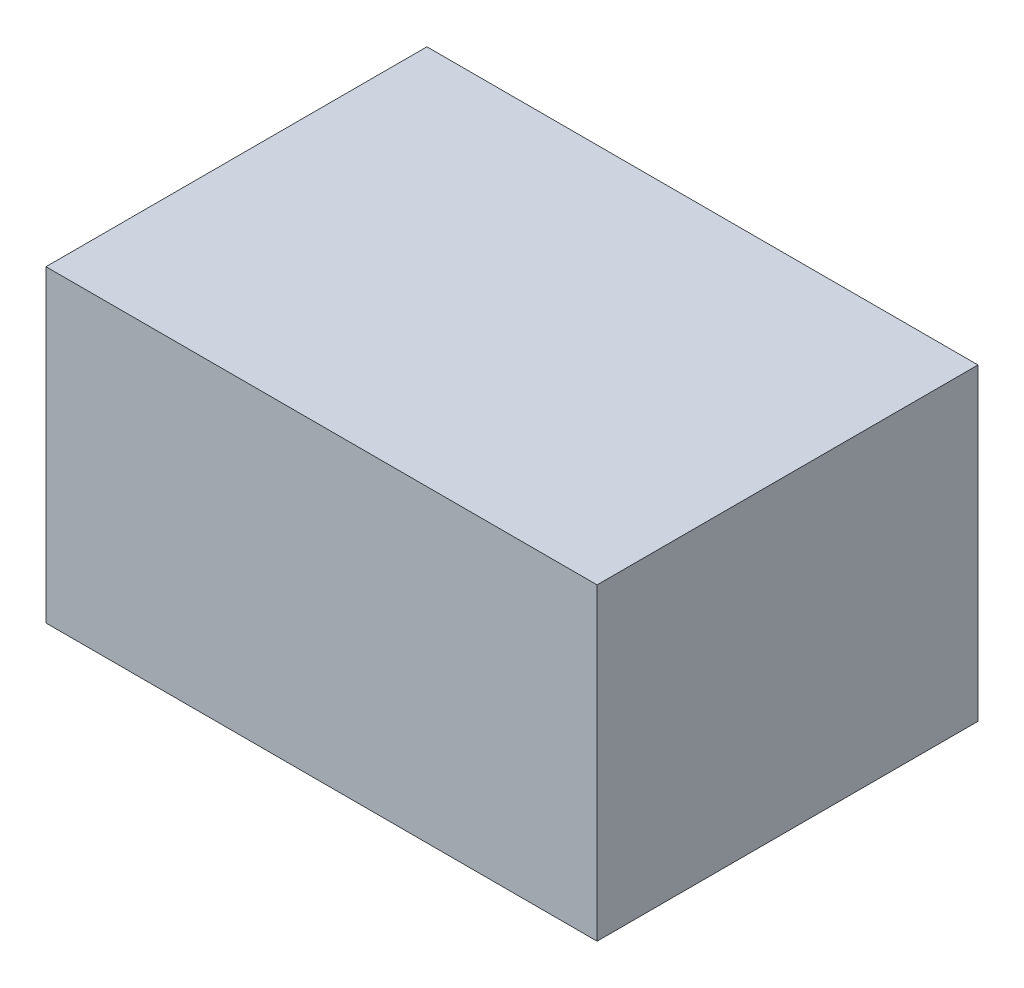
ISO-10303-21;
HEADER;
FILE_DESCRIPTION(('STEP AP214'),'2;1');
FILE_NAME('part.step','',(''),(''),'','','');
FILE_SCHEMA(('AUTOMOTIVE_DESIGN { 1 0 10303 214 1 1 1 1 }'));
ENDSEC;
DATA;
#1=APPLICATION_CONTEXT('core data for automotive mechanical design processes');
#2=APPLICATION_PROTOCOL_DEFINITION('international standard','automotive_design',2000,#1);
#3=PRODUCT_CONTEXT('',#1,'mechanical');
#4=PRODUCT('Part','Part','',(#3));
#5=PRODUCT_RELATED_PRODUCT_CATEGORY('part','',(#4));
#6=PRODUCT_DEFINITION_FORMATION('','',#4);
#7=PRODUCT_DEFINITION_CONTEXT('part definition',#1,'design');
#8=PRODUCT_DEFINITION('design','',#6,#7);
#9=PRODUCT_DEFINITION_SHAPE('','',#8);
#10=(LENGTH_UNIT() NAMED_UNIT(*) SI_UNIT(.MILLI.,.METRE.));
#11=(NAMED_UNIT(*) PLANE_ANGLE_UNIT() SI_UNIT($,.RADIAN.));
#12=(NAMED_UNIT(*) SI_UNIT($,.STERADIAN.) SOLID_ANGLE_UNIT());
#13=UNCERTAINTY_MEASURE_WITH_UNIT(LENGTH_MEASURE(1.E-05),#10,'distance_accuracy_value','');
#14=(GEOMETRIC_REPRESENTATION_CONTEXT(3) GLOBAL_UNCERTAINTY_ASSIGNED_CONTEXT((#13)) GLOBAL_UNIT_ASSIGNED_CONTEXT((#10,
#11,#12)) REPRESENTATION_CONTEXT('',''));
#15=CARTESIAN_POINT('',(0.,0.,0.));
#16=DIRECTION('',(0.,0.,1.));
#17=DIRECTION('',(1.,0.,0.));
#18=AXIS2_PLACEMENT_3D('',#15,#16,#17);
#19=CARTESIAN_POINT('',(-3.75,-2.25,8.64));
#20=DIRECTION('',(1.,0.,0.));
#21=DIRECTION('',(0.,0.,-1.));
#22=AXIS2_PLACEMENT_3D('',#19,#20,#21);
#23=PLANE('',#22);
#24=DIRECTION('',(0.,-1.,0.));
#25=VECTOR('',#24,1.);
#26=CARTESIAN_POINT('',(-3.75,-2.25,0.));
#27=LINE('',#26,#25);
#28=CARTESIAN_POINT('',(-3.75,4.75,0.));
#29=VERTEX_POINT('',#28);
#30=CARTESIAN_POINT('',(-3.75,-2.25,0.));
#31=VERTEX_POINT('',#30);
#32=EDGE_CURVE('E96',#29,#31,#27,.T.);
#33=ORIENTED_EDGE('',*,*,#32,.T.);
#34=DIRECTION('',(0.,0.,-1.));
#35=VECTOR('',#34,1.);
#36=CARTESIAN_POINT('',(-3.75,-2.25,8.64));
#37=LINE('',#36,#35);
#38=CARTESIAN_POINT('',(-3.75,-2.25,8.64));
#39=VERTEX_POINT('',#38);
#40=EDGE_CURVE('E11',#39,#31,#37,.T.);
#41=ORIENTED_EDGE('',*,*,#40,.F.);
#42=DIRECTION('',(0.,-1.,0.));
#43=VECTOR('',#42,1.);
#44=CARTESIAN_POINT('',(-3.75,-2.25,8.64));
#45=LINE('',#44,#43);
#46=CARTESIAN_POINT('',(-3.75,4.75,8.64));
#47=VERTEX_POINT('',#46);
#48=EDGE_CURVE('E84',#47,#39,#45,.T.);
#49=ORIENTED_EDGE('',*,*,#48,.F.);
#50=DIRECTION('',(0.,0.,-1.));
#51=VECTOR('',#50,1.);
#52=CARTESIAN_POINT('',(-3.75,4.75,8.64));
#53=LINE('',#52,#51);
#54=EDGE_CURVE('E92',#47,#29,#53,.T.);
#55=ORIENTED_EDGE('',*,*,#54,.T.);
#56=EDGE_LOOP('',(#33,#41,#49,#55));
#57=FACE_BOUND('',#56,.T.);
#58=ADVANCED_FACE('F33',(#57),#23,.F.);
#59=CARTESIAN_POINT('',(8.75,-2.25,8.64));
#60=DIRECTION('',(0.,1.,0.));
#61=DIRECTION('',(0.,0.,1.));
#62=AXIS2_PLACEMENT_3D('',#59,#60,#61);
#63=PLANE('',#62);
#64=DIRECTION('',(1.,0.,0.));
#65=VECTOR('',#64,1.);
#66=CARTESIAN_POINT('',(8.75,-2.25,0.));
#67=LINE('',#66,#65);
#68=CARTESIAN_POINT('',(8.75,-2.25,0.));
#69=VERTEX_POINT('',#68);
#70=EDGE_CURVE('E88',#31,#69,#67,.T.);
#71=ORIENTED_EDGE('',*,*,#70,.T.);
#72=DIRECTION('',(0.,0.,-1.));
#73=VECTOR('',#72,1.);
#74=CARTESIAN_POINT('',(8.75,-2.25,8.64));
#75=LINE('',#74,#73);
#76=CARTESIAN_POINT('',(8.75,-2.25,8.64));
#77=VERTEX_POINT('',#76);
#78=EDGE_CURVE('E41',#77,#69,#75,.T.);
#79=ORIENTED_EDGE('',*,*,#78,.F.);
#80=DIRECTION('',(1.,0.,0.));
#81=VECTOR('',#80,1.);
#82=CARTESIAN_POINT('',(8.75,-2.25,8.64));
#83=LINE('',#82,#81);
#84=EDGE_CURVE('E79',#39,#77,#83,.T.);
#85=ORIENTED_EDGE('',*,*,#84,.F.);
#86=ORIENTED_EDGE('',*,*,#40,.T.);
#87=EDGE_LOOP('',(#71,#79,#85,#86));
#88=FACE_BOUND('',#87,.T.);
#89=ADVANCED_FACE('F87',(#88),#63,.F.);
#90=CARTESIAN_POINT('',(8.75,4.75,8.64));
#91=DIRECTION('',(-1.,0.,0.));
#92=DIRECTION('',(0.,0.,1.));
#93=AXIS2_PLACEMENT_3D('',#90,#91,#92);
#94=PLANE('',#93);
#95=DIRECTION('',(0.,1.,0.));
#96=VECTOR('',#95,1.);
#97=CARTESIAN_POINT('',(8.75,4.75,0.));
#98=LINE('',#97,#96);
#99=CARTESIAN_POINT('',(8.75,4.75,0.));
#100=VERTEX_POINT('',#99);
#101=EDGE_CURVE('E66',#69,#100,#98,.T.);
#102=ORIENTED_EDGE('',*,*,#101,.T.);
#103=DIRECTION('',(0.,0.,-1.));
#104=VECTOR('',#103,1.);
#105=CARTESIAN_POINT('',(8.75,4.75,8.64));
#106=LINE('',#105,#104);
#107=CARTESIAN_POINT('',(8.75,4.75,8.64));
#108=VERTEX_POINT('',#107);
#109=EDGE_CURVE('E89',#108,#100,#106,.T.);
#110=ORIENTED_EDGE('',*,*,#109,.F.);
#111=DIRECTION('',(0.,1.,0.));
#112=VECTOR('',#111,1.);
#113=CARTESIAN_POINT('',(8.75,4.75,8.64));
#114=LINE('',#113,#112);
#115=EDGE_CURVE('E82',#77,#108,#114,.T.);
#116=ORIENTED_EDGE('',*,*,#115,.F.);
#117=ORIENTED_EDGE('',*,*,#78,.T.);
#118=EDGE_LOOP('',(#102,#110,#116,#117));
#119=FACE_BOUND('',#118,.T.);
#120=ADVANCED_FACE('F90',(#119),#94,.F.);
#121=CARTESIAN_POINT('',(-3.75,4.75,8.64));
#122=DIRECTION('',(0.,-1.,0.));
#123=DIRECTION('',(0.,0.,-1.));
#124=AXIS2_PLACEMENT_3D('',#121,#122,#123);
#125=PLANE('',#124);
#126=DIRECTION('',(-1.,0.,0.));
#127=VECTOR('',#126,1.);
#128=CARTESIAN_POINT('',(-3.75,4.75,0.));
#129=LINE('',#128,#127);
#130=EDGE_CURVE('E72',#100,#29,#129,.T.);
#131=ORIENTED_EDGE('',*,*,#130,.T.);
#132=ORIENTED_EDGE('',*,*,#54,.F.);
#133=DIRECTION('',(-1.,0.,0.));
#134=VECTOR('',#133,1.);
#135=CARTESIAN_POINT('',(-3.75,4.75,8.64));
#136=LINE('',#135,#134);
#137=EDGE_CURVE('E49',#108,#47,#136,.T.);
#138=ORIENTED_EDGE('',*,*,#137,.F.);
#139=ORIENTED_EDGE('',*,*,#109,.T.);
#140=EDGE_LOOP('',(#131,#132,#138,#139));
#141=FACE_BOUND('',#140,.T.);
#142=ADVANCED_FACE('F103',(#141),#125,.F.);
#143=CARTESIAN_POINT('',(0.,0.,8.64));
#144=DIRECTION('',(0.,0.,-1.));
#145=DIRECTION('',(-1.,0.,0.));
#146=AXIS2_PLACEMENT_3D('',#143,#144,#145);
#147=PLANE('',#146);
#148=ORIENTED_EDGE('',*,*,#48,.T.);
#149=ORIENTED_EDGE('',*,*,#84,.T.);
#150=ORIENTED_EDGE('',*,*,#115,.T.);
#151=ORIENTED_EDGE('',*,*,#137,.T.);
#152=EDGE_LOOP('',(#148,#149,#150,#151));
#153=FACE_BOUND('',#152,.T.);
#154=ADVANCED_FACE('F80',(#153),#147,.F.);
#155=CARTESIAN_POINT('',(0.,0.,0.));
#156=DIRECTION('',(0.,0.,-1.));
#157=DIRECTION('',(-1.,0.,0.));
#158=AXIS2_PLACEMENT_3D('',#155,#156,#157);
#159=PLANE('',#158);
#160=ORIENTED_EDGE('',*,*,#32,.F.);
#161=ORIENTED_EDGE('',*,*,#130,.F.);
#162=ORIENTED_EDGE('',*,*,#101,.F.);
#163=ORIENTED_EDGE('',*,*,#70,.F.);
#164=EDGE_LOOP('',(#160,#161,#162,#163));
#165=FACE_BOUND('',#164,.T.);
#166=ADVANCED_FACE('F106',(#165),#159,.T.);
#167=CLOSED_SHELL('',(#58,#89,#120,#142,#154,#166));
#168=MANIFOLD_SOLID_BREP('B2',#167);
#169=ADVANCED_BREP_SHAPE_REPRESENTATION('',(#18,#168),#14);
#170=SHAPE_DEFINITION_REPRESENTATION(#9,#169);
ENDSEC;
END-ISO-10303-21;
